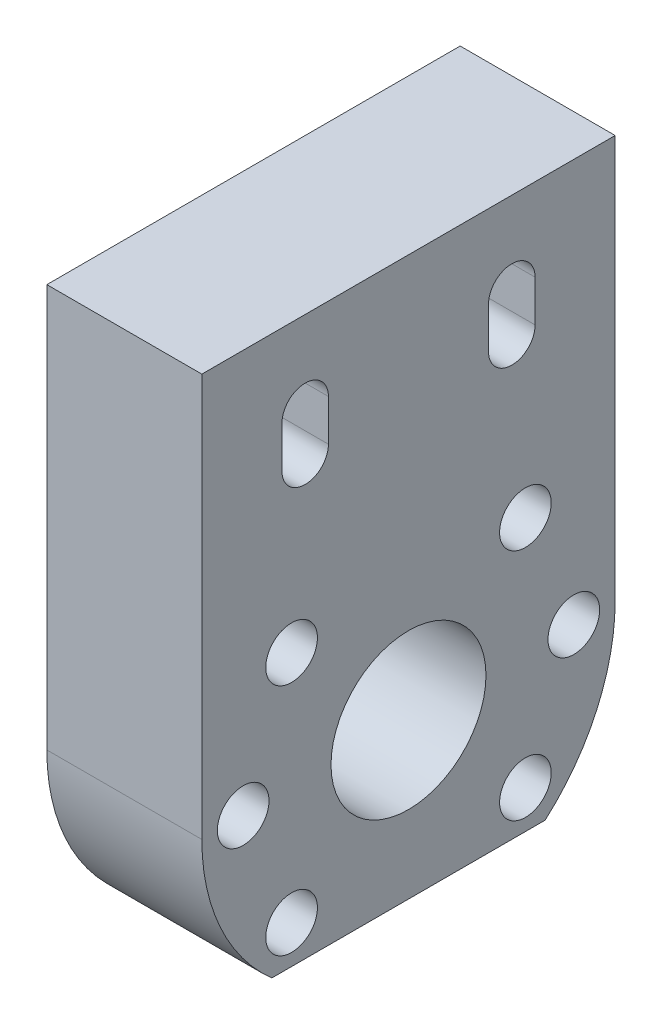
ISO-10303-21;
HEADER;
FILE_DESCRIPTION(('STEP AP214'),'2;1');
FILE_NAME('part.step','',(''),(''),'','','');
FILE_SCHEMA(('AUTOMOTIVE_DESIGN { 1 0 10303 214 1 1 1 1 }'));
ENDSEC;
DATA;
#1=APPLICATION_CONTEXT('core data for automotive mechanical design processes');
#2=APPLICATION_PROTOCOL_DEFINITION('international standard','automotive_design',2000,#1);
#3=PRODUCT_CONTEXT('',#1,'mechanical');
#4=PRODUCT('Part','Part','',(#3));
#5=PRODUCT_RELATED_PRODUCT_CATEGORY('part','',(#4));
#6=PRODUCT_DEFINITION_FORMATION('','',#4);
#7=PRODUCT_DEFINITION_CONTEXT('part definition',#1,'design');
#8=PRODUCT_DEFINITION('design','',#6,#7);
#9=PRODUCT_DEFINITION_SHAPE('','',#8);
#10=(LENGTH_UNIT() NAMED_UNIT(*) SI_UNIT(.MILLI.,.METRE.));
#11=(NAMED_UNIT(*) PLANE_ANGLE_UNIT() SI_UNIT($,.RADIAN.));
#12=(NAMED_UNIT(*) SI_UNIT($,.STERADIAN.) SOLID_ANGLE_UNIT());
#13=UNCERTAINTY_MEASURE_WITH_UNIT(LENGTH_MEASURE(1.E-05),#10,'distance_accuracy_value','');
#14=(GEOMETRIC_REPRESENTATION_CONTEXT(3) GLOBAL_UNCERTAINTY_ASSIGNED_CONTEXT((#13)) GLOBAL_UNIT_ASSIGNED_CONTEXT((#10,
#11,#12)) REPRESENTATION_CONTEXT('',''));
#15=CARTESIAN_POINT('',(0.,0.,0.));
#16=DIRECTION('',(0.,0.,1.));
#17=DIRECTION('',(1.,0.,0.));
#18=AXIS2_PLACEMENT_3D('',#15,#16,#17);
#19=CARTESIAN_POINT('',(15.,0.,0.));
#20=DIRECTION('',(-1.,0.,0.));
#21=DIRECTION('',(0.,0.,1.));
#22=AXIS2_PLACEMENT_3D('',#19,#20,#21);
#23=PLANE('',#22);
#24=CARTESIAN_POINT('',(15.,11.3137084989846,-11.3137084989849));
#25=DIRECTION('',(1.,0.,0.));
#26=DIRECTION('',(0.,0.,-1.));
#27=AXIS2_PLACEMENT_3D('',#24,#25,#26);
#28=CIRCLE('',#27,2.5);
#29=CARTESIAN_POINT('',(15.,11.3137084989846,-13.8137084989849));
#30=VERTEX_POINT('',#29);
#31=EDGE_CURVE('E174',#30,#30,#28,.T.);
#32=ORIENTED_EDGE('',*,*,#31,.F.);
#33=EDGE_LOOP('',(#32));
#34=FACE_BOUND('',#33,.T.);
#35=CARTESIAN_POINT('',(15.,11.3137084989849,11.3137084989847));
#36=DIRECTION('',(1.,0.,0.));
#37=DIRECTION('',(0.,0.,-1.));
#38=AXIS2_PLACEMENT_3D('',#35,#36,#37);
#39=CIRCLE('',#38,2.5);
#40=CARTESIAN_POINT('',(15.,11.3137084989849,8.81370849898466));
#41=VERTEX_POINT('',#40);
#42=EDGE_CURVE('E180',#41,#41,#39,.T.);
#43=ORIENTED_EDGE('',*,*,#42,.F.);
#44=EDGE_LOOP('',(#43));
#45=FACE_BOUND('',#44,.T.);
#46=CARTESIAN_POINT('',(15.,1.1172740284298E-13,16.));
#47=DIRECTION('',(1.,0.,0.));
#48=DIRECTION('',(0.,0.,-1.));
#49=AXIS2_PLACEMENT_3D('',#46,#47,#48);
#50=CIRCLE('',#49,2.5);
#51=CARTESIAN_POINT('',(15.,1.1172740284298E-13,13.5));
#52=VERTEX_POINT('',#51);
#53=EDGE_CURVE('E186',#52,#52,#50,.T.);
#54=ORIENTED_EDGE('',*,*,#53,.F.);
#55=EDGE_LOOP('',(#54));
#56=FACE_BOUND('',#55,.T.);
#57=CARTESIAN_POINT('',(15.,-11.3137084989847,11.3137084989848));
#58=DIRECTION('',(1.,0.,0.));
#59=DIRECTION('',(0.,0.,-1.));
#60=AXIS2_PLACEMENT_3D('',#57,#58,#59);
#61=CIRCLE('',#60,2.5);
#62=CARTESIAN_POINT('',(15.,-11.3137084989847,8.81370849898482));
#63=VERTEX_POINT('',#62);
#64=EDGE_CURVE('E192',#63,#63,#61,.T.);
#65=ORIENTED_EDGE('',*,*,#64,.F.);
#66=EDGE_LOOP('',(#65));
#67=FACE_BOUND('',#66,.T.);
#68=CARTESIAN_POINT('',(15.,31.,10.));
#69=DIRECTION('',(1.,0.,0.));
#70=DIRECTION('',(0.,0.,1.));
#71=AXIS2_PLACEMENT_3D('',#68,#69,#70);
#72=CIRCLE('',#71,2.25);
#73=CARTESIAN_POINT('',(15.,31.,7.75));
#74=VERTEX_POINT('',#73);
#75=CARTESIAN_POINT('',(15.,31.,12.25));
#76=VERTEX_POINT('',#75);
#77=EDGE_CURVE('E198',#74,#76,#72,.T.);
#78=ORIENTED_EDGE('',*,*,#77,.F.);
#79=DIRECTION('',(0.,1.,0.));
#80=VECTOR('',#79,1.);
#81=CARTESIAN_POINT('',(15.,27.,7.75));
#82=LINE('',#81,#80);
#83=CARTESIAN_POINT('',(15.,27.,7.75));
#84=VERTEX_POINT('',#83);
#85=EDGE_CURVE('E206',#84,#74,#82,.T.);
#86=ORIENTED_EDGE('',*,*,#85,.F.);
#87=CARTESIAN_POINT('',(15.,27.,10.));
#88=DIRECTION('',(1.,0.,0.));
#89=DIRECTION('',(0.,0.,1.));
#90=AXIS2_PLACEMENT_3D('',#87,#88,#89);
#91=CIRCLE('',#90,2.25);
#92=CARTESIAN_POINT('',(15.,27.,12.25));
#93=VERTEX_POINT('',#92);
#94=EDGE_CURVE('E203',#93,#84,#91,.T.);
#95=ORIENTED_EDGE('',*,*,#94,.F.);
#96=DIRECTION('',(0.,-1.,0.));
#97=VECTOR('',#96,1.);
#98=CARTESIAN_POINT('',(15.,27.,12.25));
#99=LINE('',#98,#97);
#100=EDGE_CURVE('E200',#76,#93,#99,.T.);
#101=ORIENTED_EDGE('',*,*,#100,.F.);
#102=EDGE_LOOP('',(#78,#86,#95,#101));
#103=FACE_BOUND('',#102,.T.);
#104=CARTESIAN_POINT('',(15.,0.,0.));
#105=DIRECTION('',(1.,0.,0.));
#106=DIRECTION('',(0.,0.,1.));
#107=AXIS2_PLACEMENT_3D('',#104,#105,#106);
#108=CIRCLE('',#107,20.);
#109=CARTESIAN_POINT('',(15.,1.4210854715202E-13,20.));
#110=VERTEX_POINT('',#109);
#111=CARTESIAN_POINT('',(15.,-15.,13.228756555323));
#112=VERTEX_POINT('',#111);
#113=EDGE_CURVE('E247',#110,#112,#108,.T.);
#114=ORIENTED_EDGE('',*,*,#113,.T.);
#115=DIRECTION('',(0.,0.,-1.));
#116=VECTOR('',#115,1.);
#117=CARTESIAN_POINT('',(15.,-15.,13.228756555323));
#118=LINE('',#117,#116);
#119=CARTESIAN_POINT('',(15.,-15.,-13.228756555323));
#120=VERTEX_POINT('',#119);
#121=EDGE_CURVE('E250',#112,#120,#118,.T.);
#122=ORIENTED_EDGE('',*,*,#121,.T.);
#123=CARTESIAN_POINT('',(15.,0.,0.));
#124=DIRECTION('',(1.,0.,0.));
#125=DIRECTION('',(0.,0.,1.));
#126=AXIS2_PLACEMENT_3D('',#123,#124,#125);
#127=CIRCLE('',#126,20.);
#128=CARTESIAN_POINT('',(15.,1.4210854715202E-13,-20.));
#129=VERTEX_POINT('',#128);
#130=EDGE_CURVE('E253',#120,#129,#127,.T.);
#131=ORIENTED_EDGE('',*,*,#130,.T.);
#132=DIRECTION('',(0.,1.,0.));
#133=VECTOR('',#132,1.);
#134=CARTESIAN_POINT('',(15.,1.4210854715202E-13,-20.));
#135=LINE('',#134,#133);
#136=CARTESIAN_POINT('',(15.,39.,-20.));
#137=VERTEX_POINT('',#136);
#138=EDGE_CURVE('E255',#129,#137,#135,.T.);
#139=ORIENTED_EDGE('',*,*,#138,.T.);
#140=DIRECTION('',(0.,0.,1.));
#141=VECTOR('',#140,1.);
#142=CARTESIAN_POINT('',(15.,39.,20.));
#143=LINE('',#142,#141);
#144=CARTESIAN_POINT('',(15.,39.,20.));
#145=VERTEX_POINT('',#144);
#146=EDGE_CURVE('E257',#137,#145,#143,.T.);
#147=ORIENTED_EDGE('',*,*,#146,.T.);
#148=DIRECTION('',(0.,-1.,0.));
#149=VECTOR('',#148,1.);
#150=CARTESIAN_POINT('',(15.,1.4210854715202E-13,20.));
#151=LINE('',#150,#149);
#152=EDGE_CURVE('E259',#145,#110,#151,.T.);
#153=ORIENTED_EDGE('',*,*,#152,.T.);
#154=EDGE_LOOP('',(#114,#122,#131,#139,#147,#153));
#155=FACE_BOUND('',#154,.T.);
#156=CARTESIAN_POINT('',(15.,0.,0.));
#157=DIRECTION('',(1.,0.,0.));
#158=DIRECTION('',(0.,0.,-1.));
#159=AXIS2_PLACEMENT_3D('',#156,#157,#158);
#160=CIRCLE('',#159,7.5);
#161=CARTESIAN_POINT('',(15.,0.,-7.5));
#162=VERTEX_POINT('',#161);
#163=EDGE_CURVE('E241',#162,#162,#160,.T.);
#164=ORIENTED_EDGE('',*,*,#163,.F.);
#165=EDGE_LOOP('',(#164));
#166=FACE_BOUND('',#165,.T.);
#167=CARTESIAN_POINT('',(15.,0.,-16.));
#168=DIRECTION('',(1.,0.,0.));
#169=DIRECTION('',(0.,0.,-1.));
#170=AXIS2_PLACEMENT_3D('',#167,#168,#169);
#171=CIRCLE('',#170,2.5);
#172=CARTESIAN_POINT('',(15.,0.,-18.5));
#173=VERTEX_POINT('',#172);
#174=EDGE_CURVE('E235',#173,#173,#171,.T.);
#175=ORIENTED_EDGE('',*,*,#174,.F.);
#176=EDGE_LOOP('',(#175));
#177=FACE_BOUND('',#176,.T.);
#178=CARTESIAN_POINT('',(15.,-11.3137084989848,-11.3137084989847));
#179=DIRECTION('',(1.,0.,0.));
#180=DIRECTION('',(0.,0.,-1.));
#181=AXIS2_PLACEMENT_3D('',#178,#179,#180);
#182=CIRCLE('',#181,2.5);
#183=CARTESIAN_POINT('',(15.,-11.3137084989848,-13.8137084989847));
#184=VERTEX_POINT('',#183);
#185=EDGE_CURVE('E229',#184,#184,#182,.T.);
#186=ORIENTED_EDGE('',*,*,#185,.F.);
#187=EDGE_LOOP('',(#186));
#188=FACE_BOUND('',#187,.T.);
#189=CARTESIAN_POINT('',(15.,31.,-10.));
#190=DIRECTION('',(1.,0.,0.));
#191=DIRECTION('',(0.,0.,-1.));
#192=AXIS2_PLACEMENT_3D('',#189,#190,#191);
#193=CIRCLE('',#192,2.25);
#194=CARTESIAN_POINT('',(15.,31.,-12.25));
#195=VERTEX_POINT('',#194);
#196=CARTESIAN_POINT('',(15.,31.,-7.75));
#197=VERTEX_POINT('',#196);
#198=EDGE_CURVE('E138',#195,#197,#193,.T.);
#199=ORIENTED_EDGE('',*,*,#198,.F.);
#200=DIRECTION('',(0.,1.,0.));
#201=VECTOR('',#200,1.);
#202=CARTESIAN_POINT('',(15.,27.,-12.25));
#203=LINE('',#202,#201);
#204=CARTESIAN_POINT('',(15.,27.,-12.25));
#205=VERTEX_POINT('',#204);
#206=EDGE_CURVE('E160',#205,#195,#203,.T.);
#207=ORIENTED_EDGE('',*,*,#206,.F.);
#208=CARTESIAN_POINT('',(15.,27.,-10.));
#209=DIRECTION('',(1.,0.,0.));
#210=DIRECTION('',(0.,0.,-1.));
#211=AXIS2_PLACEMENT_3D('',#208,#209,#210);
#212=CIRCLE('',#211,2.25);
#213=CARTESIAN_POINT('',(15.,27.,-7.75));
#214=VERTEX_POINT('',#213);
#215=EDGE_CURVE('E158',#214,#205,#212,.T.);
#216=ORIENTED_EDGE('',*,*,#215,.F.);
#217=DIRECTION('',(0.,-1.,0.));
#218=VECTOR('',#217,1.);
#219=CARTESIAN_POINT('',(15.,27.,-7.75));
#220=LINE('',#219,#218);
#221=EDGE_CURVE('E146',#197,#214,#220,.T.);
#222=ORIENTED_EDGE('',*,*,#221,.F.);
#223=EDGE_LOOP('',(#199,#207,#216,#222));
#224=FACE_BOUND('',#223,.T.);
#225=ADVANCED_FACE('F37',(#34,#45,#56,#67,#103,#155,#166,#177,#188,#224),#23,.F.);
#226=CARTESIAN_POINT('',(0.,0.,0.));
#227=DIRECTION('',(-1.,0.,0.));
#228=DIRECTION('',(0.,0.,1.));
#229=AXIS2_PLACEMENT_3D('',#226,#227,#228);
#230=PLANE('',#229);
#231=CARTESIAN_POINT('',(0.,11.3137084989849,11.3137084989847));
#232=DIRECTION('',(1.,0.,0.));
#233=DIRECTION('',(0.,0.,-1.));
#234=AXIS2_PLACEMENT_3D('',#231,#232,#233);
#235=CIRCLE('',#234,2.5);
#236=CARTESIAN_POINT('',(0.,11.3137084989849,8.81370849898466));
#237=VERTEX_POINT('',#236);
#238=EDGE_CURVE('E177',#237,#237,#235,.T.);
#239=ORIENTED_EDGE('',*,*,#238,.T.);
#240=EDGE_LOOP('',(#239));
#241=FACE_BOUND('',#240,.T.);
#242=CARTESIAN_POINT('',(0.,-11.3137084989847,11.3137084989848));
#243=DIRECTION('',(1.,0.,0.));
#244=DIRECTION('',(0.,0.,-1.));
#245=AXIS2_PLACEMENT_3D('',#242,#243,#244);
#246=CIRCLE('',#245,2.5);
#247=CARTESIAN_POINT('',(0.,-11.3137084989847,8.81370849898482));
#248=VERTEX_POINT('',#247);
#249=EDGE_CURVE('E189',#248,#248,#246,.T.);
#250=ORIENTED_EDGE('',*,*,#249,.T.);
#251=EDGE_LOOP('',(#250));
#252=FACE_BOUND('',#251,.T.);
#253=CARTESIAN_POINT('',(0.,0.,-16.));
#254=DIRECTION('',(1.,0.,0.));
#255=DIRECTION('',(0.,0.,-1.));
#256=AXIS2_PLACEMENT_3D('',#253,#254,#255);
#257=CIRCLE('',#256,2.5);
#258=CARTESIAN_POINT('',(0.,0.,-18.5));
#259=VERTEX_POINT('',#258);
#260=EDGE_CURVE('E232',#259,#259,#257,.T.);
#261=ORIENTED_EDGE('',*,*,#260,.T.);
#262=EDGE_LOOP('',(#261));
#263=FACE_BOUND('',#262,.T.);
#264=CARTESIAN_POINT('',(0.,0.,0.));
#265=DIRECTION('',(1.,0.,0.));
#266=DIRECTION('',(0.,0.,1.));
#267=AXIS2_PLACEMENT_3D('',#264,#265,#266);
#268=CIRCLE('',#267,20.);
#269=CARTESIAN_POINT('',(0.,1.4210854715202E-13,20.));
#270=VERTEX_POINT('',#269);
#271=CARTESIAN_POINT('',(0.,-15.,13.228756555323));
#272=VERTEX_POINT('',#271);
#273=EDGE_CURVE('E244',#270,#272,#268,.T.);
#274=ORIENTED_EDGE('',*,*,#273,.F.);
#275=DIRECTION('',(0.,-1.,0.));
#276=VECTOR('',#275,1.);
#277=CARTESIAN_POINT('',(0.,1.4210854715202E-13,20.));
#278=LINE('',#277,#276);
#279=CARTESIAN_POINT('',(0.,39.,20.));
#280=VERTEX_POINT('',#279);
#281=EDGE_CURVE('E251',#280,#270,#278,.T.);
#282=ORIENTED_EDGE('',*,*,#281,.F.);
#283=DIRECTION('',(0.,0.,1.));
#284=VECTOR('',#283,1.);
#285=CARTESIAN_POINT('',(0.,39.,20.));
#286=LINE('',#285,#284);
#287=CARTESIAN_POINT('',(0.,39.,-20.));
#288=VERTEX_POINT('',#287);
#289=EDGE_CURVE('E270',#288,#280,#286,.T.);
#290=ORIENTED_EDGE('',*,*,#289,.F.);
#291=DIRECTION('',(0.,1.,0.));
#292=VECTOR('',#291,1.);
#293=CARTESIAN_POINT('',(0.,1.4210854715202E-13,-20.));
#294=LINE('',#293,#292);
#295=CARTESIAN_POINT('',(0.,1.4210854715202E-13,-20.));
#296=VERTEX_POINT('',#295);
#297=EDGE_CURVE('E268',#296,#288,#294,.T.);
#298=ORIENTED_EDGE('',*,*,#297,.F.);
#299=CARTESIAN_POINT('',(0.,0.,0.));
#300=DIRECTION('',(1.,0.,0.));
#301=DIRECTION('',(0.,0.,1.));
#302=AXIS2_PLACEMENT_3D('',#299,#300,#301);
#303=CIRCLE('',#302,20.);
#304=CARTESIAN_POINT('',(0.,-15.,-13.228756555323));
#305=VERTEX_POINT('',#304);
#306=EDGE_CURVE('E266',#305,#296,#303,.T.);
#307=ORIENTED_EDGE('',*,*,#306,.F.);
#308=DIRECTION('',(0.,0.,-1.));
#309=VECTOR('',#308,1.);
#310=CARTESIAN_POINT('',(0.,-15.,13.228756555323));
#311=LINE('',#310,#309);
#312=EDGE_CURVE('E264',#272,#305,#311,.T.);
#313=ORIENTED_EDGE('',*,*,#312,.F.);
#314=EDGE_LOOP('',(#274,#282,#290,#298,#307,#313));
#315=FACE_BOUND('',#314,.T.);
#316=CARTESIAN_POINT('',(0.,0.,0.));
#317=DIRECTION('',(1.,0.,0.));
#318=DIRECTION('',(0.,0.,-1.));
#319=AXIS2_PLACEMENT_3D('',#316,#317,#318);
#320=CIRCLE('',#319,7.5);
#321=CARTESIAN_POINT('',(0.,0.,-7.5));
#322=VERTEX_POINT('',#321);
#323=EDGE_CURVE('E238',#322,#322,#320,.T.);
#324=ORIENTED_EDGE('',*,*,#323,.T.);
#325=EDGE_LOOP('',(#324));
#326=FACE_BOUND('',#325,.T.);
#327=CARTESIAN_POINT('',(0.,-11.3137084989848,-11.3137084989847));
#328=DIRECTION('',(1.,0.,0.));
#329=DIRECTION('',(0.,0.,-1.));
#330=AXIS2_PLACEMENT_3D('',#327,#328,#329);
#331=CIRCLE('',#330,2.5);
#332=CARTESIAN_POINT('',(0.,-11.3137084989848,-13.8137084989847));
#333=VERTEX_POINT('',#332);
#334=EDGE_CURVE('E228',#333,#333,#331,.T.);
#335=ORIENTED_EDGE('',*,*,#334,.T.);
#336=EDGE_LOOP('',(#335));
#337=FACE_BOUND('',#336,.T.);
#338=DIRECTION('',(0.,1.,0.));
#339=VECTOR('',#338,1.);
#340=CARTESIAN_POINT('',(0.,27.,7.75));
#341=LINE('',#340,#339);
#342=CARTESIAN_POINT('',(0.,27.,7.75));
#343=VERTEX_POINT('',#342);
#344=CARTESIAN_POINT('',(0.,31.,7.75));
#345=VERTEX_POINT('',#344);
#346=EDGE_CURVE('E201',#343,#345,#341,.T.);
#347=ORIENTED_EDGE('',*,*,#346,.T.);
#348=CARTESIAN_POINT('',(0.,31.,10.));
#349=DIRECTION('',(1.,0.,0.));
#350=DIRECTION('',(0.,0.,1.));
#351=AXIS2_PLACEMENT_3D('',#348,#349,#350);
#352=CIRCLE('',#351,2.25);
#353=CARTESIAN_POINT('',(0.,31.,12.25));
#354=VERTEX_POINT('',#353);
#355=EDGE_CURVE('E195',#345,#354,#352,.T.);
#356=ORIENTED_EDGE('',*,*,#355,.T.);
#357=DIRECTION('',(0.,-1.,0.));
#358=VECTOR('',#357,1.);
#359=CARTESIAN_POINT('',(0.,27.,12.25));
#360=LINE('',#359,#358);
#361=CARTESIAN_POINT('',(0.,27.,12.25));
#362=VERTEX_POINT('',#361);
#363=EDGE_CURVE('E211',#354,#362,#360,.T.);
#364=ORIENTED_EDGE('',*,*,#363,.T.);
#365=CARTESIAN_POINT('',(0.,27.,10.));
#366=DIRECTION('',(1.,0.,0.));
#367=DIRECTION('',(0.,0.,1.));
#368=AXIS2_PLACEMENT_3D('',#365,#366,#367);
#369=CIRCLE('',#368,2.25);
#370=EDGE_CURVE('E214',#362,#343,#369,.T.);
#371=ORIENTED_EDGE('',*,*,#370,.T.);
#372=EDGE_LOOP('',(#347,#356,#364,#371));
#373=FACE_BOUND('',#372,.T.);
#374=CARTESIAN_POINT('',(0.,1.1172740284298E-13,16.));
#375=DIRECTION('',(1.,0.,0.));
#376=DIRECTION('',(0.,0.,-1.));
#377=AXIS2_PLACEMENT_3D('',#374,#375,#376);
#378=CIRCLE('',#377,2.5);
#379=CARTESIAN_POINT('',(0.,1.1172740284298E-13,13.5));
#380=VERTEX_POINT('',#379);
#381=EDGE_CURVE('E183',#380,#380,#378,.T.);
#382=ORIENTED_EDGE('',*,*,#381,.T.);
#383=EDGE_LOOP('',(#382));
#384=FACE_BOUND('',#383,.T.);
#385=CARTESIAN_POINT('',(0.,11.3137084989846,-11.3137084989849));
#386=DIRECTION('',(1.,0.,0.));
#387=DIRECTION('',(0.,0.,-1.));
#388=AXIS2_PLACEMENT_3D('',#385,#386,#387);
#389=CIRCLE('',#388,2.5);
#390=CARTESIAN_POINT('',(0.,11.3137084989846,-13.8137084989849));
#391=VERTEX_POINT('',#390);
#392=EDGE_CURVE('E154',#391,#391,#389,.T.);
#393=ORIENTED_EDGE('',*,*,#392,.T.);
#394=EDGE_LOOP('',(#393));
#395=FACE_BOUND('',#394,.T.);
#396=DIRECTION('',(0.,1.,0.));
#397=VECTOR('',#396,1.);
#398=CARTESIAN_POINT('',(0.,27.,-12.25));
#399=LINE('',#398,#397);
#400=CARTESIAN_POINT('',(0.,27.,-12.25));
#401=VERTEX_POINT('',#400);
#402=CARTESIAN_POINT('',(0.,31.,-12.25));
#403=VERTEX_POINT('',#402);
#404=EDGE_CURVE('E147',#401,#403,#399,.T.);
#405=ORIENTED_EDGE('',*,*,#404,.T.);
#406=CARTESIAN_POINT('',(0.,31.,-10.));
#407=DIRECTION('',(1.,0.,0.));
#408=DIRECTION('',(0.,0.,-1.));
#409=AXIS2_PLACEMENT_3D('',#406,#407,#408);
#410=CIRCLE('',#409,2.25);
#411=CARTESIAN_POINT('',(0.,31.,-7.75));
#412=VERTEX_POINT('',#411);
#413=EDGE_CURVE('E60',#403,#412,#410,.T.);
#414=ORIENTED_EDGE('',*,*,#413,.T.);
#415=DIRECTION('',(0.,-1.,0.));
#416=VECTOR('',#415,1.);
#417=CARTESIAN_POINT('',(0.,27.,-7.75));
#418=LINE('',#417,#416);
#419=CARTESIAN_POINT('',(0.,27.,-7.75));
#420=VERTEX_POINT('',#419);
#421=EDGE_CURVE('E153',#412,#420,#418,.T.);
#422=ORIENTED_EDGE('',*,*,#421,.T.);
#423=CARTESIAN_POINT('',(0.,27.,-10.));
#424=DIRECTION('',(1.,0.,0.));
#425=DIRECTION('',(0.,0.,-1.));
#426=AXIS2_PLACEMENT_3D('',#423,#424,#425);
#427=CIRCLE('',#426,2.25);
#428=EDGE_CURVE('E166',#420,#401,#427,.T.);
#429=ORIENTED_EDGE('',*,*,#428,.T.);
#430=EDGE_LOOP('',(#405,#414,#422,#429));
#431=FACE_BOUND('',#430,.T.);
#432=ADVANCED_FACE('F294',(#241,#252,#263,#315,#326,#337,#373,#384,#395,#431),#230,.T.);
#433=CARTESIAN_POINT('',(15.,0.,0.));
#434=DIRECTION('',(-1.,0.,0.));
#435=DIRECTION('',(0.,0.,1.));
#436=AXIS2_PLACEMENT_3D('',#433,#434,#435);
#437=CYLINDRICAL_SURFACE('',#436,20.);
#438=ORIENTED_EDGE('',*,*,#273,.T.);
#439=DIRECTION('',(-1.,0.,0.));
#440=VECTOR('',#439,1.);
#441=CARTESIAN_POINT('',(15.,-15.,13.228756555323));
#442=LINE('',#441,#440);
#443=EDGE_CURVE('E11',#112,#272,#442,.T.);
#444=ORIENTED_EDGE('',*,*,#443,.F.);
#445=ORIENTED_EDGE('',*,*,#113,.F.);
#446=DIRECTION('',(-1.,0.,0.));
#447=VECTOR('',#446,1.);
#448=CARTESIAN_POINT('',(15.,1.4210854715202E-13,20.));
#449=LINE('',#448,#447);
#450=EDGE_CURVE('E261',#110,#270,#449,.T.);
#451=ORIENTED_EDGE('',*,*,#450,.T.);
#452=EDGE_LOOP('',(#438,#444,#445,#451));
#453=FACE_BOUND('',#452,.T.);
#454=ADVANCED_FACE('F39',(#453),#437,.T.);
#455=CARTESIAN_POINT('',(15.,-15.,13.228756555323));
#456=DIRECTION('',(0.,1.,0.));
#457=DIRECTION('',(0.,0.,1.));
#458=AXIS2_PLACEMENT_3D('',#455,#456,#457);
#459=PLANE('',#458);
#460=ORIENTED_EDGE('',*,*,#312,.T.);
#461=DIRECTION('',(-1.,0.,0.));
#462=VECTOR('',#461,1.);
#463=CARTESIAN_POINT('',(15.,-15.,-13.228756555323));
#464=LINE('',#463,#462);
#465=EDGE_CURVE('E45',#120,#305,#464,.T.);
#466=ORIENTED_EDGE('',*,*,#465,.F.);
#467=ORIENTED_EDGE('',*,*,#121,.F.);
#468=ORIENTED_EDGE('',*,*,#443,.T.);
#469=EDGE_LOOP('',(#460,#466,#467,#468));
#470=FACE_BOUND('',#469,.T.);
#471=ADVANCED_FACE('F312',(#470),#459,.F.);
#472=CARTESIAN_POINT('',(15.,0.,0.));
#473=DIRECTION('',(-1.,0.,0.));
#474=DIRECTION('',(0.,0.,1.));
#475=AXIS2_PLACEMENT_3D('',#472,#473,#474);
#476=CYLINDRICAL_SURFACE('',#475,20.);
#477=ORIENTED_EDGE('',*,*,#306,.T.);
#478=DIRECTION('',(-1.,0.,0.));
#479=VECTOR('',#478,1.);
#480=CARTESIAN_POINT('',(15.,1.4210854715202E-13,-20.));
#481=LINE('',#480,#479);
#482=EDGE_CURVE('E281',#129,#296,#481,.T.);
#483=ORIENTED_EDGE('',*,*,#482,.F.);
#484=ORIENTED_EDGE('',*,*,#130,.F.);
#485=ORIENTED_EDGE('',*,*,#465,.T.);
#486=EDGE_LOOP('',(#477,#483,#484,#485));
#487=FACE_BOUND('',#486,.T.);
#488=ADVANCED_FACE('F288',(#487),#476,.T.);
#489=CARTESIAN_POINT('',(15.,1.4210854715202E-13,-20.));
#490=DIRECTION('',(0.,0.,1.));
#491=DIRECTION('',(1.,0.,0.));
#492=AXIS2_PLACEMENT_3D('',#489,#490,#491);
#493=PLANE('',#492);
#494=ORIENTED_EDGE('',*,*,#297,.T.);
#495=DIRECTION('',(-1.,0.,0.));
#496=VECTOR('',#495,1.);
#497=CARTESIAN_POINT('',(15.,39.,-20.));
#498=LINE('',#497,#496);
#499=EDGE_CURVE('E278',#137,#288,#498,.T.);
#500=ORIENTED_EDGE('',*,*,#499,.F.);
#501=ORIENTED_EDGE('',*,*,#138,.F.);
#502=ORIENTED_EDGE('',*,*,#482,.T.);
#503=EDGE_LOOP('',(#494,#500,#501,#502));
#504=FACE_BOUND('',#503,.T.);
#505=ADVANCED_FACE('F300',(#504),#493,.F.);
#506=CARTESIAN_POINT('',(15.,39.,20.));
#507=DIRECTION('',(0.,-1.,0.));
#508=DIRECTION('',(0.,0.,-1.));
#509=AXIS2_PLACEMENT_3D('',#506,#507,#508);
#510=PLANE('',#509);
#511=ORIENTED_EDGE('',*,*,#289,.T.);
#512=DIRECTION('',(-1.,0.,0.));
#513=VECTOR('',#512,1.);
#514=CARTESIAN_POINT('',(15.,39.,20.));
#515=LINE('',#514,#513);
#516=EDGE_CURVE('E275',#145,#280,#515,.T.);
#517=ORIENTED_EDGE('',*,*,#516,.F.);
#518=ORIENTED_EDGE('',*,*,#146,.F.);
#519=ORIENTED_EDGE('',*,*,#499,.T.);
#520=EDGE_LOOP('',(#511,#517,#518,#519));
#521=FACE_BOUND('',#520,.T.);
#522=ADVANCED_FACE('F304',(#521),#510,.F.);
#523=CARTESIAN_POINT('',(15.,1.4210854715202E-13,20.));
#524=DIRECTION('',(0.,0.,-1.));
#525=DIRECTION('',(-1.,0.,0.));
#526=AXIS2_PLACEMENT_3D('',#523,#524,#525);
#527=PLANE('',#526);
#528=ORIENTED_EDGE('',*,*,#281,.T.);
#529=ORIENTED_EDGE('',*,*,#450,.F.);
#530=ORIENTED_EDGE('',*,*,#152,.F.);
#531=ORIENTED_EDGE('',*,*,#516,.T.);
#532=EDGE_LOOP('',(#528,#529,#530,#531));
#533=FACE_BOUND('',#532,.T.);
#534=ADVANCED_FACE('F315',(#533),#527,.F.);
#535=CARTESIAN_POINT('',(15.,0.,0.));
#536=DIRECTION('',(-1.,0.,0.));
#537=DIRECTION('',(0.,0.,1.));
#538=AXIS2_PLACEMENT_3D('',#535,#536,#537);
#539=CYLINDRICAL_SURFACE('',#538,7.5);
#540=ORIENTED_EDGE('',*,*,#163,.T.);
#541=EDGE_LOOP('',(#540));
#542=FACE_BOUND('',#541,.T.);
#543=ORIENTED_EDGE('',*,*,#323,.F.);
#544=EDGE_LOOP('',(#543));
#545=FACE_BOUND('',#544,.T.);
#546=ADVANCED_FACE('F317',(#542,#545),#539,.F.);
#547=CARTESIAN_POINT('',(15.,0.,-16.));
#548=DIRECTION('',(-1.,0.,0.));
#549=DIRECTION('',(0.,0.,1.));
#550=AXIS2_PLACEMENT_3D('',#547,#548,#549);
#551=CYLINDRICAL_SURFACE('',#550,2.5);
#552=ORIENTED_EDGE('',*,*,#174,.T.);
#553=EDGE_LOOP('',(#552));
#554=FACE_BOUND('',#553,.T.);
#555=ORIENTED_EDGE('',*,*,#260,.F.);
#556=EDGE_LOOP('',(#555));
#557=FACE_BOUND('',#556,.T.);
#558=ADVANCED_FACE('F323',(#554,#557),#551,.F.);
#559=CARTESIAN_POINT('',(15.,-11.3137084989848,-11.3137084989847));
#560=DIRECTION('',(-1.,0.,0.));
#561=DIRECTION('',(0.,0.,1.));
#562=AXIS2_PLACEMENT_3D('',#559,#560,#561);
#563=CYLINDRICAL_SURFACE('',#562,2.5);
#564=ORIENTED_EDGE('',*,*,#185,.T.);
#565=EDGE_LOOP('',(#564));
#566=FACE_BOUND('',#565,.T.);
#567=ORIENTED_EDGE('',*,*,#334,.F.);
#568=EDGE_LOOP('',(#567));
#569=FACE_BOUND('',#568,.T.);
#570=ADVANCED_FACE('F340',(#566,#569),#563,.F.);
#571=CARTESIAN_POINT('',(15.,31.,10.));
#572=DIRECTION('',(-1.,0.,0.));
#573=DIRECTION('',(0.,0.,1.));
#574=AXIS2_PLACEMENT_3D('',#571,#572,#573);
#575=CYLINDRICAL_SURFACE('',#574,2.25);
#576=ORIENTED_EDGE('',*,*,#355,.F.);
#577=DIRECTION('',(-1.,0.,0.));
#578=VECTOR('',#577,1.);
#579=CARTESIAN_POINT('',(15.,31.,7.75));
#580=LINE('',#579,#578);
#581=EDGE_CURVE('E208',#74,#345,#580,.T.);
#582=ORIENTED_EDGE('',*,*,#581,.F.);
#583=ORIENTED_EDGE('',*,*,#77,.T.);
#584=DIRECTION('',(-1.,0.,0.));
#585=VECTOR('',#584,1.);
#586=CARTESIAN_POINT('',(15.,31.,12.25));
#587=LINE('',#586,#585);
#588=EDGE_CURVE('E225',#76,#354,#587,.T.);
#589=ORIENTED_EDGE('',*,*,#588,.T.);
#590=EDGE_LOOP('',(#576,#582,#583,#589));
#591=FACE_BOUND('',#590,.T.);
#592=ADVANCED_FACE('F344',(#591),#575,.F.);
#593=CARTESIAN_POINT('',(15.,27.,12.25));
#594=DIRECTION('',(0.,0.,-1.));
#595=DIRECTION('',(-1.,0.,0.));
#596=AXIS2_PLACEMENT_3D('',#593,#594,#595);
#597=PLANE('',#596);
#598=ORIENTED_EDGE('',*,*,#363,.F.);
#599=ORIENTED_EDGE('',*,*,#588,.F.);
#600=ORIENTED_EDGE('',*,*,#100,.T.);
#601=DIRECTION('',(-1.,0.,0.));
#602=VECTOR('',#601,1.);
#603=CARTESIAN_POINT('',(15.,27.,12.25));
#604=LINE('',#603,#602);
#605=EDGE_CURVE('E223',#93,#362,#604,.T.);
#606=ORIENTED_EDGE('',*,*,#605,.T.);
#607=EDGE_LOOP('',(#598,#599,#600,#606));
#608=FACE_BOUND('',#607,.T.);
#609=ADVANCED_FACE('F348',(#608),#597,.T.);
#610=CARTESIAN_POINT('',(15.,27.,10.));
#611=DIRECTION('',(-1.,0.,0.));
#612=DIRECTION('',(0.,0.,1.));
#613=AXIS2_PLACEMENT_3D('',#610,#611,#612);
#614=CYLINDRICAL_SURFACE('',#613,2.25);
#615=ORIENTED_EDGE('',*,*,#370,.F.);
#616=ORIENTED_EDGE('',*,*,#605,.F.);
#617=ORIENTED_EDGE('',*,*,#94,.T.);
#618=DIRECTION('',(-1.,0.,0.));
#619=VECTOR('',#618,1.);
#620=CARTESIAN_POINT('',(15.,27.,7.75));
#621=LINE('',#620,#619);
#622=EDGE_CURVE('E221',#84,#343,#621,.T.);
#623=ORIENTED_EDGE('',*,*,#622,.T.);
#624=EDGE_LOOP('',(#615,#616,#617,#623));
#625=FACE_BOUND('',#624,.T.);
#626=ADVANCED_FACE('F352',(#625),#614,.F.);
#627=CARTESIAN_POINT('',(15.,27.,7.75));
#628=DIRECTION('',(0.,0.,1.));
#629=DIRECTION('',(1.,0.,0.));
#630=AXIS2_PLACEMENT_3D('',#627,#628,#629);
#631=PLANE('',#630);
#632=ORIENTED_EDGE('',*,*,#346,.F.);
#633=ORIENTED_EDGE('',*,*,#622,.F.);
#634=ORIENTED_EDGE('',*,*,#85,.T.);
#635=ORIENTED_EDGE('',*,*,#581,.T.);
#636=EDGE_LOOP('',(#632,#633,#634,#635));
#637=FACE_BOUND('',#636,.T.);
#638=ADVANCED_FACE('F356',(#637),#631,.T.);
#639=CARTESIAN_POINT('',(15.,-11.3137084989847,11.3137084989848));
#640=DIRECTION('',(-1.,0.,0.));
#641=DIRECTION('',(0.,0.,1.));
#642=AXIS2_PLACEMENT_3D('',#639,#640,#641);
#643=CYLINDRICAL_SURFACE('',#642,2.5);
#644=ORIENTED_EDGE('',*,*,#64,.T.);
#645=EDGE_LOOP('',(#644));
#646=FACE_BOUND('',#645,.T.);
#647=ORIENTED_EDGE('',*,*,#249,.F.);
#648=EDGE_LOOP('',(#647));
#649=FACE_BOUND('',#648,.T.);
#650=ADVANCED_FACE('F360',(#646,#649),#643,.F.);
#651=CARTESIAN_POINT('',(15.,1.1172740284298E-13,16.));
#652=DIRECTION('',(-1.,0.,0.));
#653=DIRECTION('',(0.,0.,1.));
#654=AXIS2_PLACEMENT_3D('',#651,#652,#653);
#655=CYLINDRICAL_SURFACE('',#654,2.5);
#656=ORIENTED_EDGE('',*,*,#53,.T.);
#657=EDGE_LOOP('',(#656));
#658=FACE_BOUND('',#657,.T.);
#659=ORIENTED_EDGE('',*,*,#381,.F.);
#660=EDGE_LOOP('',(#659));
#661=FACE_BOUND('',#660,.T.);
#662=ADVANCED_FACE('F364',(#658,#661),#655,.F.);
#663=CARTESIAN_POINT('',(15.,11.3137084989849,11.3137084989847));
#664=DIRECTION('',(-1.,0.,0.));
#665=DIRECTION('',(0.,0.,1.));
#666=AXIS2_PLACEMENT_3D('',#663,#664,#665);
#667=CYLINDRICAL_SURFACE('',#666,2.5);
#668=ORIENTED_EDGE('',*,*,#42,.T.);
#669=EDGE_LOOP('',(#668));
#670=FACE_BOUND('',#669,.T.);
#671=ORIENTED_EDGE('',*,*,#238,.F.);
#672=EDGE_LOOP('',(#671));
#673=FACE_BOUND('',#672,.T.);
#674=ADVANCED_FACE('F368',(#670,#673),#667,.F.);
#675=CARTESIAN_POINT('',(15.,11.3137084989846,-11.3137084989849));
#676=DIRECTION('',(-1.,0.,0.));
#677=DIRECTION('',(0.,0.,1.));
#678=AXIS2_PLACEMENT_3D('',#675,#676,#677);
#679=CYLINDRICAL_SURFACE('',#678,2.5);
#680=ORIENTED_EDGE('',*,*,#31,.T.);
#681=EDGE_LOOP('',(#680));
#682=FACE_BOUND('',#681,.T.);
#683=ORIENTED_EDGE('',*,*,#392,.F.);
#684=EDGE_LOOP('',(#683));
#685=FACE_BOUND('',#684,.T.);
#686=ADVANCED_FACE('F372',(#682,#685),#679,.F.);
#687=CARTESIAN_POINT('',(15.,31.,-10.));
#688=DIRECTION('',(-1.,0.,0.));
#689=DIRECTION('',(0.,0.,1.));
#690=AXIS2_PLACEMENT_3D('',#687,#688,#689);
#691=CYLINDRICAL_SURFACE('',#690,2.25);
#692=ORIENTED_EDGE('',*,*,#413,.F.);
#693=DIRECTION('',(-1.,0.,0.));
#694=VECTOR('',#693,1.);
#695=CARTESIAN_POINT('',(15.,31.,-12.25));
#696=LINE('',#695,#694);
#697=EDGE_CURVE('E142',#195,#403,#696,.T.);
#698=ORIENTED_EDGE('',*,*,#697,.F.);
#699=ORIENTED_EDGE('',*,*,#198,.T.);
#700=DIRECTION('',(-1.,0.,0.));
#701=VECTOR('',#700,1.);
#702=CARTESIAN_POINT('',(15.,31.,-7.75));
#703=LINE('',#702,#701);
#704=EDGE_CURVE('E141',#197,#412,#703,.T.);
#705=ORIENTED_EDGE('',*,*,#704,.T.);
#706=EDGE_LOOP('',(#692,#698,#699,#705));
#707=FACE_BOUND('',#706,.T.);
#708=ADVANCED_FACE('F140',(#707),#691,.F.);
#709=CARTESIAN_POINT('',(15.,27.,-7.75));
#710=DIRECTION('',(0.,0.,-1.));
#711=DIRECTION('',(-1.,0.,0.));
#712=AXIS2_PLACEMENT_3D('',#709,#710,#711);
#713=PLANE('',#712);
#714=ORIENTED_EDGE('',*,*,#421,.F.);
#715=ORIENTED_EDGE('',*,*,#704,.F.);
#716=ORIENTED_EDGE('',*,*,#221,.T.);
#717=DIRECTION('',(-1.,0.,0.));
#718=VECTOR('',#717,1.);
#719=CARTESIAN_POINT('',(15.,27.,-7.75));
#720=LINE('',#719,#718);
#721=EDGE_CURVE('E155',#214,#420,#720,.T.);
#722=ORIENTED_EDGE('',*,*,#721,.T.);
#723=EDGE_LOOP('',(#714,#715,#716,#722));
#724=FACE_BOUND('',#723,.T.);
#725=ADVANCED_FACE('F150',(#724),#713,.T.);
#726=CARTESIAN_POINT('',(15.,27.,-10.));
#727=DIRECTION('',(-1.,0.,0.));
#728=DIRECTION('',(0.,0.,1.));
#729=AXIS2_PLACEMENT_3D('',#726,#727,#728);
#730=CYLINDRICAL_SURFACE('',#729,2.25);
#731=ORIENTED_EDGE('',*,*,#428,.F.);
#732=ORIENTED_EDGE('',*,*,#721,.F.);
#733=ORIENTED_EDGE('',*,*,#215,.T.);
#734=DIRECTION('',(-1.,0.,0.));
#735=VECTOR('',#734,1.);
#736=CARTESIAN_POINT('',(15.,27.,-12.25));
#737=LINE('',#736,#735);
#738=EDGE_CURVE('E52',#205,#401,#737,.T.);
#739=ORIENTED_EDGE('',*,*,#738,.T.);
#740=EDGE_LOOP('',(#731,#732,#733,#739));
#741=FACE_BOUND('',#740,.T.);
#742=ADVANCED_FACE('F381',(#741),#730,.F.);
#743=CARTESIAN_POINT('',(15.,27.,-12.25));
#744=DIRECTION('',(0.,0.,1.));
#745=DIRECTION('',(1.,0.,0.));
#746=AXIS2_PLACEMENT_3D('',#743,#744,#745);
#747=PLANE('',#746);
#748=ORIENTED_EDGE('',*,*,#404,.F.);
#749=ORIENTED_EDGE('',*,*,#738,.F.);
#750=ORIENTED_EDGE('',*,*,#206,.T.);
#751=ORIENTED_EDGE('',*,*,#697,.T.);
#752=EDGE_LOOP('',(#748,#749,#750,#751));
#753=FACE_BOUND('',#752,.T.);
#754=ADVANCED_FACE('F384',(#753),#747,.T.);
#755=CLOSED_SHELL('',(#225,#432,#454,#471,#488,#505,#522,#534,#546,#558,#570,#592,#609,#626,
#638,#650,#662,#674,#686,#708,#725,#742,#754));
#756=MANIFOLD_SOLID_BREP('B2',#755);
#757=ADVANCED_BREP_SHAPE_REPRESENTATION('',(#18,#756),#14);
#758=SHAPE_DEFINITION_REPRESENTATION(#9,#757);
ENDSEC;
END-ISO-10303-21;
